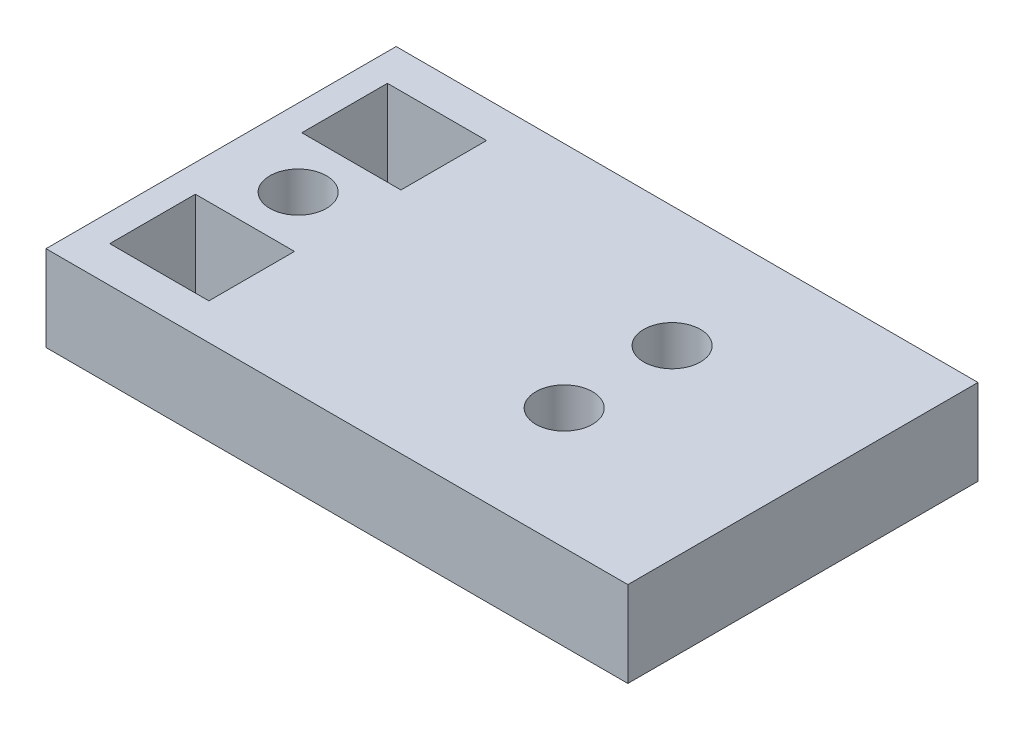
ISO-10303-21;
HEADER;
FILE_DESCRIPTION(('STEP AP214'),'2;1');
FILE_NAME('part.step','',(''),(''),'','','');
FILE_SCHEMA(('AUTOMOTIVE_DESIGN { 1 0 10303 214 1 1 1 1 }'));
ENDSEC;
DATA;
#1=APPLICATION_CONTEXT('core data for automotive mechanical design processes');
#2=APPLICATION_PROTOCOL_DEFINITION('international standard','automotive_design',2000,#1);
#3=PRODUCT_CONTEXT('',#1,'mechanical');
#4=PRODUCT('Part','Part','',(#3));
#5=PRODUCT_RELATED_PRODUCT_CATEGORY('part','',(#4));
#6=PRODUCT_DEFINITION_FORMATION('','',#4);
#7=PRODUCT_DEFINITION_CONTEXT('part definition',#1,'design');
#8=PRODUCT_DEFINITION('design','',#6,#7);
#9=PRODUCT_DEFINITION_SHAPE('','',#8);
#10=(LENGTH_UNIT() NAMED_UNIT(*) SI_UNIT(.MILLI.,.METRE.));
#11=(NAMED_UNIT(*) PLANE_ANGLE_UNIT() SI_UNIT($,.RADIAN.));
#12=(NAMED_UNIT(*) SI_UNIT($,.STERADIAN.) SOLID_ANGLE_UNIT());
#13=UNCERTAINTY_MEASURE_WITH_UNIT(LENGTH_MEASURE(1.E-05),#10,'distance_accuracy_value','');
#14=(GEOMETRIC_REPRESENTATION_CONTEXT(3) GLOBAL_UNCERTAINTY_ASSIGNED_CONTEXT((#13)) GLOBAL_UNIT_ASSIGNED_CONTEXT((#10,
#11,#12)) REPRESENTATION_CONTEXT('',''));
#15=CARTESIAN_POINT('',(0.,0.,0.));
#16=DIRECTION('',(0.,0.,1.));
#17=DIRECTION('',(1.,0.,0.));
#18=AXIS2_PLACEMENT_3D('',#15,#16,#17);
#19=CARTESIAN_POINT('',(0.,49.6080000980001,0.));
#20=DIRECTION('',(0.,1.,0.));
#21=DIRECTION('',(0.,0.,1.));
#22=AXIS2_PLACEMENT_3D('',#19,#20,#21);
#23=PLANE('',#22);
#24=CARTESIAN_POINT('',(303.010750816,49.6080000980001,50.8900000115));
#25=DIRECTION('',(0.,1.,0.));
#26=DIRECTION('',(0.,0.,1.));
#27=AXIS2_PLACEMENT_3D('',#24,#25,#26);
#28=CIRCLE('',#27,2.09999999100001);
#29=CARTESIAN_POINT('',(303.010750816,49.6080000980001,52.9900000025001));
#30=VERTEX_POINT('',#29);
#31=EDGE_CURVE('E152',#30,#30,#28,.T.);
#32=ORIENTED_EDGE('',*,*,#31,.F.);
#33=EDGE_LOOP('',(#32));
#34=FACE_BOUND('',#33,.T.);
#35=DIRECTION('',(0.,0.,1.));
#36=VECTOR('',#35,1.);
#37=CARTESIAN_POINT('',(273.570750799999,49.6080000980001,41.91));
#38=LINE('',#37,#36);
#39=CARTESIAN_POINT('',(273.570750799999,49.6080000980001,41.91));
#40=VERTEX_POINT('',#39);
#41=CARTESIAN_POINT('',(273.570750799999,49.6080000980001,67.8700000230001));
#42=VERTEX_POINT('',#41);
#43=EDGE_CURVE('E199',#40,#42,#38,.T.);
#44=ORIENTED_EDGE('',*,*,#43,.T.);
#45=DIRECTION('',(1.,0.,0.));
#46=VECTOR('',#45,1.);
#47=CARTESIAN_POINT('',(273.570750799999,49.6080000980001,67.8700000230001));
#48=LINE('',#47,#46);
#49=CARTESIAN_POINT('',(316.710750816,49.6080000980001,67.8700000230001));
#50=VERTEX_POINT('',#49);
#51=EDGE_CURVE('E202',#42,#50,#48,.T.);
#52=ORIENTED_EDGE('',*,*,#51,.T.);
#53=DIRECTION('',(0.,0.,-1.));
#54=VECTOR('',#53,1.);
#55=CARTESIAN_POINT('',(316.710750816,49.6080000980001,41.91));
#56=LINE('',#55,#54);
#57=CARTESIAN_POINT('',(316.710750816,49.6080000980001,41.91));
#58=VERTEX_POINT('',#57);
#59=EDGE_CURVE('E205',#50,#58,#56,.T.);
#60=ORIENTED_EDGE('',*,*,#59,.T.);
#61=DIRECTION('',(-1.,0.,0.));
#62=VECTOR('',#61,1.);
#63=CARTESIAN_POINT('',(273.570750799999,49.6080000980001,41.91));
#64=LINE('',#63,#62);
#65=EDGE_CURVE('E207',#58,#40,#64,.T.);
#66=ORIENTED_EDGE('',*,*,#65,.T.);
#67=EDGE_LOOP('',(#44,#52,#60,#66));
#68=FACE_BOUND('',#67,.T.);
#69=CARTESIAN_POINT('',(279.2857508,49.6080000980001,54.8900000115));
#70=DIRECTION('',(0.,1.,0.));
#71=DIRECTION('',(0.,0.,1.));
#72=AXIS2_PLACEMENT_3D('',#69,#70,#71);
#73=CIRCLE('',#72,2.09999999100001);
#74=CARTESIAN_POINT('',(279.2857508,49.6080000980001,56.9900000025001));
#75=VERTEX_POINT('',#74);
#76=EDGE_CURVE('E193',#75,#75,#73,.T.);
#77=ORIENTED_EDGE('',*,*,#76,.F.);
#78=EDGE_LOOP('',(#77));
#79=FACE_BOUND('',#78,.T.);
#80=DIRECTION('',(-1.,0.,0.));
#81=VECTOR('',#80,1.);
#82=CARTESIAN_POINT('',(275.610750783999,49.6080000980001,44.5950000275));
#83=LINE('',#82,#81);
#84=CARTESIAN_POINT('',(282.960750816,49.6080000980001,44.5950000275));
#85=VERTEX_POINT('',#84);
#86=CARTESIAN_POINT('',(275.610750783999,49.6080000980001,44.5950000275));
#87=VERTEX_POINT('',#86);
#88=EDGE_CURVE('E164',#85,#87,#83,.T.);
#89=ORIENTED_EDGE('',*,*,#88,.F.);
#90=DIRECTION('',(0.,0.,-1.));
#91=VECTOR('',#90,1.);
#92=CARTESIAN_POINT('',(282.960750816,49.6080000980001,50.9450000275));
#93=LINE('',#92,#91);
#94=CARTESIAN_POINT('',(282.960750816,49.6080000980001,50.9450000275));
#95=VERTEX_POINT('',#94);
#96=EDGE_CURVE('E162',#95,#85,#93,.T.);
#97=ORIENTED_EDGE('',*,*,#96,.F.);
#98=DIRECTION('',(1.,0.,0.));
#99=VECTOR('',#98,1.);
#100=CARTESIAN_POINT('',(275.610750783999,49.6080000980001,50.9450000275));
#101=LINE('',#100,#99);
#102=CARTESIAN_POINT('',(275.610750783999,49.6080000980001,50.9450000275));
#103=VERTEX_POINT('',#102);
#104=EDGE_CURVE('E170',#103,#95,#101,.T.);
#105=ORIENTED_EDGE('',*,*,#104,.F.);
#106=DIRECTION('',(0.,0.,1.));
#107=VECTOR('',#106,1.);
#108=CARTESIAN_POINT('',(275.610750783999,49.6080000980001,50.9450000275));
#109=LINE('',#108,#107);
#110=EDGE_CURVE('E167',#87,#103,#109,.T.);
#111=ORIENTED_EDGE('',*,*,#110,.F.);
#112=EDGE_LOOP('',(#89,#97,#105,#111));
#113=FACE_BOUND('',#112,.T.);
#114=DIRECTION('',(0.,0.,1.));
#115=VECTOR('',#114,1.);
#116=CARTESIAN_POINT('',(275.610750783999,49.6080000980001,58.8349999955001));
#117=LINE('',#116,#115);
#118=CARTESIAN_POINT('',(275.610750783999,49.6080000980001,58.8349999955001));
#119=VERTEX_POINT('',#118);
#120=CARTESIAN_POINT('',(275.610750783999,49.6080000980001,65.1849999955));
#121=VERTEX_POINT('',#120);
#122=EDGE_CURVE('E131',#119,#121,#117,.T.);
#123=ORIENTED_EDGE('',*,*,#122,.F.);
#124=DIRECTION('',(-1.,0.,0.));
#125=VECTOR('',#124,1.);
#126=CARTESIAN_POINT('',(275.610750783999,49.6080000980001,58.8349999955001));
#127=LINE('',#126,#125);
#128=CARTESIAN_POINT('',(282.960750816,49.6080000980001,58.8349999955001));
#129=VERTEX_POINT('',#128);
#130=EDGE_CURVE('E123',#129,#119,#127,.T.);
#131=ORIENTED_EDGE('',*,*,#130,.F.);
#132=DIRECTION('',(0.,0.,-1.));
#133=VECTOR('',#132,1.);
#134=CARTESIAN_POINT('',(282.960750816,49.6080000980001,58.8349999955001));
#135=LINE('',#134,#133);
#136=CARTESIAN_POINT('',(282.960750816,49.6080000980001,65.1849999955));
#137=VERTEX_POINT('',#136);
#138=EDGE_CURVE('E146',#137,#129,#135,.T.);
#139=ORIENTED_EDGE('',*,*,#138,.F.);
#140=DIRECTION('',(1.,0.,0.));
#141=VECTOR('',#140,1.);
#142=CARTESIAN_POINT('',(275.610750783999,49.6080000980001,65.1849999955));
#143=LINE('',#142,#141);
#144=EDGE_CURVE('E144',#121,#137,#143,.T.);
#145=ORIENTED_EDGE('',*,*,#144,.F.);
#146=EDGE_LOOP('',(#123,#131,#139,#145));
#147=FACE_BOUND('',#146,.T.);
#148=CARTESIAN_POINT('',(303.010750815999,49.6080000980001,58.8900000115));
#149=DIRECTION('',(0.,1.,0.));
#150=DIRECTION('',(0.,0.,1.));
#151=AXIS2_PLACEMENT_3D('',#148,#149,#150);
#152=CIRCLE('',#151,2.09999999100001);
#153=CARTESIAN_POINT('',(303.010750815999,49.6080000980001,60.9900000025001));
#154=VERTEX_POINT('',#153);
#155=EDGE_CURVE('E287',#154,#154,#152,.T.);
#156=ORIENTED_EDGE('',*,*,#155,.F.);
#157=EDGE_LOOP('',(#156));
#158=FACE_BOUND('',#157,.T.);
#159=ADVANCED_FACE('F34',(#34,#68,#79,#113,#147,#158),#23,.T.);
#160=CARTESIAN_POINT('',(0.,43.2580000980001,0.));
#161=DIRECTION('',(0.,1.,0.));
#162=DIRECTION('',(0.,0.,1.));
#163=AXIS2_PLACEMENT_3D('',#160,#161,#162);
#164=PLANE('',#163);
#165=DIRECTION('',(0.,0.,-1.));
#166=VECTOR('',#165,1.);
#167=CARTESIAN_POINT('',(282.960750816,43.2580000980001,50.9450000275));
#168=LINE('',#167,#166);
#169=CARTESIAN_POINT('',(282.960750816,43.2580000980001,50.9450000275));
#170=VERTEX_POINT('',#169);
#171=CARTESIAN_POINT('',(282.960750816,43.2580000980001,44.5950000275));
#172=VERTEX_POINT('',#171);
#173=EDGE_CURVE('E139',#170,#172,#168,.T.);
#174=ORIENTED_EDGE('',*,*,#173,.T.);
#175=DIRECTION('',(-1.,0.,0.));
#176=VECTOR('',#175,1.);
#177=CARTESIAN_POINT('',(275.610750783999,43.2580000980001,44.5950000275));
#178=LINE('',#177,#176);
#179=CARTESIAN_POINT('',(275.610750783999,43.2580000980001,44.5950000275));
#180=VERTEX_POINT('',#179);
#181=EDGE_CURVE('E175',#172,#180,#178,.T.);
#182=ORIENTED_EDGE('',*,*,#181,.T.);
#183=DIRECTION('',(0.,0.,1.));
#184=VECTOR('',#183,1.);
#185=CARTESIAN_POINT('',(275.610750783999,43.2580000980001,50.9450000275));
#186=LINE('',#185,#184);
#187=CARTESIAN_POINT('',(275.610750783999,43.2580000980001,50.9450000275));
#188=VERTEX_POINT('',#187);
#189=EDGE_CURVE('E178',#180,#188,#186,.T.);
#190=ORIENTED_EDGE('',*,*,#189,.T.);
#191=DIRECTION('',(1.,0.,0.));
#192=VECTOR('',#191,1.);
#193=CARTESIAN_POINT('',(275.610750783999,43.2580000980001,50.9450000275));
#194=LINE('',#193,#192);
#195=EDGE_CURVE('E165',#188,#170,#194,.T.);
#196=ORIENTED_EDGE('',*,*,#195,.T.);
#197=EDGE_LOOP('',(#174,#182,#190,#196));
#198=FACE_BOUND('',#197,.T.);
#199=DIRECTION('',(0.,0.,1.));
#200=VECTOR('',#199,1.);
#201=CARTESIAN_POINT('',(273.570750799999,43.2580000980001,41.91));
#202=LINE('',#201,#200);
#203=CARTESIAN_POINT('',(273.570750799999,43.2580000980001,41.91));
#204=VERTEX_POINT('',#203);
#205=CARTESIAN_POINT('',(273.570750799999,43.2580000980001,67.8700000230001));
#206=VERTEX_POINT('',#205);
#207=EDGE_CURVE('E196',#204,#206,#202,.T.);
#208=ORIENTED_EDGE('',*,*,#207,.F.);
#209=DIRECTION('',(-1.,0.,0.));
#210=VECTOR('',#209,1.);
#211=CARTESIAN_POINT('',(273.570750799999,43.2580000980001,41.91));
#212=LINE('',#211,#210);
#213=CARTESIAN_POINT('',(316.710750816,43.2580000980001,41.91));
#214=VERTEX_POINT('',#213);
#215=EDGE_CURVE('E203',#214,#204,#212,.T.);
#216=ORIENTED_EDGE('',*,*,#215,.F.);
#217=DIRECTION('',(0.,0.,-1.));
#218=VECTOR('',#217,1.);
#219=CARTESIAN_POINT('',(316.710750816,43.2580000980001,41.91));
#220=LINE('',#219,#218);
#221=CARTESIAN_POINT('',(316.710750816,43.2580000980001,67.8700000230001));
#222=VERTEX_POINT('',#221);
#223=EDGE_CURVE('E214',#222,#214,#220,.T.);
#224=ORIENTED_EDGE('',*,*,#223,.F.);
#225=DIRECTION('',(1.,0.,0.));
#226=VECTOR('',#225,1.);
#227=CARTESIAN_POINT('',(273.570750799999,43.2580000980001,67.8700000230001));
#228=LINE('',#227,#226);
#229=EDGE_CURVE('E212',#206,#222,#228,.T.);
#230=ORIENTED_EDGE('',*,*,#229,.F.);
#231=EDGE_LOOP('',(#208,#216,#224,#230));
#232=FACE_BOUND('',#231,.T.);
#233=CARTESIAN_POINT('',(279.2857508,43.2580000980001,54.8900000115));
#234=DIRECTION('',(0.,1.,0.));
#235=DIRECTION('',(0.,0.,1.));
#236=AXIS2_PLACEMENT_3D('',#233,#234,#235);
#237=CIRCLE('',#236,2.09999999100001);
#238=CARTESIAN_POINT('',(279.2857508,43.2580000980001,56.9900000025001));
#239=VERTEX_POINT('',#238);
#240=EDGE_CURVE('E192',#239,#239,#237,.T.);
#241=ORIENTED_EDGE('',*,*,#240,.T.);
#242=EDGE_LOOP('',(#241));
#243=FACE_BOUND('',#242,.T.);
#244=DIRECTION('',(-1.,0.,0.));
#245=VECTOR('',#244,1.);
#246=CARTESIAN_POINT('',(275.610750783999,43.2580000980001,58.8349999955001));
#247=LINE('',#246,#245);
#248=CARTESIAN_POINT('',(282.960750816,43.2580000980001,58.8349999955001));
#249=VERTEX_POINT('',#248);
#250=CARTESIAN_POINT('',(275.610750783999,43.2580000980001,58.8349999955001));
#251=VERTEX_POINT('',#250);
#252=EDGE_CURVE('E57',#249,#251,#247,.T.);
#253=ORIENTED_EDGE('',*,*,#252,.T.);
#254=DIRECTION('',(0.,0.,1.));
#255=VECTOR('',#254,1.);
#256=CARTESIAN_POINT('',(275.610750783999,43.2580000980001,58.8349999955001));
#257=LINE('',#256,#255);
#258=CARTESIAN_POINT('',(275.610750783999,43.2580000980001,65.1849999955));
#259=VERTEX_POINT('',#258);
#260=EDGE_CURVE('E138',#251,#259,#257,.T.);
#261=ORIENTED_EDGE('',*,*,#260,.T.);
#262=DIRECTION('',(1.,0.,0.));
#263=VECTOR('',#262,1.);
#264=CARTESIAN_POINT('',(275.610750783999,43.2580000980001,65.1849999955));
#265=LINE('',#264,#263);
#266=CARTESIAN_POINT('',(282.960750816,43.2580000980001,65.1849999955));
#267=VERTEX_POINT('',#266);
#268=EDGE_CURVE('E154',#259,#267,#265,.T.);
#269=ORIENTED_EDGE('',*,*,#268,.T.);
#270=DIRECTION('',(0.,0.,-1.));
#271=VECTOR('',#270,1.);
#272=CARTESIAN_POINT('',(282.960750816,43.2580000980001,58.8349999955001));
#273=LINE('',#272,#271);
#274=EDGE_CURVE('E132',#267,#249,#273,.T.);
#275=ORIENTED_EDGE('',*,*,#274,.T.);
#276=EDGE_LOOP('',(#253,#261,#269,#275));
#277=FACE_BOUND('',#276,.T.);
#278=CARTESIAN_POINT('',(303.010750816,43.2580000980001,50.8900000115));
#279=DIRECTION('',(0.,1.,0.));
#280=DIRECTION('',(0.,0.,1.));
#281=AXIS2_PLACEMENT_3D('',#278,#279,#280);
#282=CIRCLE('',#281,2.09999999100001);
#283=CARTESIAN_POINT('',(303.010750816,43.2580000980001,52.9900000025001));
#284=VERTEX_POINT('',#283);
#285=EDGE_CURVE('E282',#284,#284,#282,.T.);
#286=ORIENTED_EDGE('',*,*,#285,.T.);
#287=EDGE_LOOP('',(#286));
#288=FACE_BOUND('',#287,.T.);
#289=CARTESIAN_POINT('',(303.010750815999,43.2580000980001,58.8900000115));
#290=DIRECTION('',(0.,1.,0.));
#291=DIRECTION('',(0.,0.,1.));
#292=AXIS2_PLACEMENT_3D('',#289,#290,#291);
#293=CIRCLE('',#292,2.09999999100001);
#294=CARTESIAN_POINT('',(303.010750815999,43.2580000980001,60.9900000025001));
#295=VERTEX_POINT('',#294);
#296=EDGE_CURVE('E285',#295,#295,#293,.T.);
#297=ORIENTED_EDGE('',*,*,#296,.T.);
#298=EDGE_LOOP('',(#297));
#299=FACE_BOUND('',#298,.T.);
#300=ADVANCED_FACE('F232',(#198,#232,#243,#277,#288,#299),#164,.F.);
#301=CARTESIAN_POINT('',(273.570750799999,49.6080000980001,41.91));
#302=DIRECTION('',(1.,0.,0.));
#303=DIRECTION('',(0.,0.,-1.));
#304=AXIS2_PLACEMENT_3D('',#301,#302,#303);
#305=PLANE('',#304);
#306=ORIENTED_EDGE('',*,*,#207,.T.);
#307=DIRECTION('',(0.,-1.,0.));
#308=VECTOR('',#307,1.);
#309=CARTESIAN_POINT('',(273.570750799999,49.6080000980001,67.8700000230001));
#310=LINE('',#309,#308);
#311=EDGE_CURVE('E11',#42,#206,#310,.T.);
#312=ORIENTED_EDGE('',*,*,#311,.F.);
#313=ORIENTED_EDGE('',*,*,#43,.F.);
#314=DIRECTION('',(0.,-1.,0.));
#315=VECTOR('',#314,1.);
#316=CARTESIAN_POINT('',(273.570750799999,49.6080000980001,41.91));
#317=LINE('',#316,#315);
#318=EDGE_CURVE('E209',#40,#204,#317,.T.);
#319=ORIENTED_EDGE('',*,*,#318,.T.);
#320=EDGE_LOOP('',(#306,#312,#313,#319));
#321=FACE_BOUND('',#320,.T.);
#322=ADVANCED_FACE('F36',(#321),#305,.F.);
#323=CARTESIAN_POINT('',(273.570750799999,49.6080000980001,67.8700000230001));
#324=DIRECTION('',(0.,0.,-1.));
#325=DIRECTION('',(-1.,0.,0.));
#326=AXIS2_PLACEMENT_3D('',#323,#324,#325);
#327=PLANE('',#326);
#328=ORIENTED_EDGE('',*,*,#229,.T.);
#329=DIRECTION('',(0.,-1.,0.));
#330=VECTOR('',#329,1.);
#331=CARTESIAN_POINT('',(316.710750816,49.6080000980001,67.8700000230001));
#332=LINE('',#331,#330);
#333=EDGE_CURVE('E42',#50,#222,#332,.T.);
#334=ORIENTED_EDGE('',*,*,#333,.F.);
#335=ORIENTED_EDGE('',*,*,#51,.F.);
#336=ORIENTED_EDGE('',*,*,#311,.T.);
#337=EDGE_LOOP('',(#328,#334,#335,#336));
#338=FACE_BOUND('',#337,.T.);
#339=ADVANCED_FACE('F243',(#338),#327,.F.);
#340=CARTESIAN_POINT('',(316.710750816,49.6080000980001,41.91));
#341=DIRECTION('',(-1.,0.,0.));
#342=DIRECTION('',(0.,0.,1.));
#343=AXIS2_PLACEMENT_3D('',#340,#341,#342);
#344=PLANE('',#343);
#345=ORIENTED_EDGE('',*,*,#223,.T.);
#346=DIRECTION('',(0.,-1.,0.));
#347=VECTOR('',#346,1.);
#348=CARTESIAN_POINT('',(316.710750816,49.6080000980001,41.91));
#349=LINE('',#348,#347);
#350=EDGE_CURVE('E219',#58,#214,#349,.T.);
#351=ORIENTED_EDGE('',*,*,#350,.F.);
#352=ORIENTED_EDGE('',*,*,#59,.F.);
#353=ORIENTED_EDGE('',*,*,#333,.T.);
#354=EDGE_LOOP('',(#345,#351,#352,#353));
#355=FACE_BOUND('',#354,.T.);
#356=ADVANCED_FACE('F226',(#355),#344,.F.);
#357=CARTESIAN_POINT('',(273.570750799999,49.6080000980001,41.91));
#358=DIRECTION('',(0.,0.,1.));
#359=DIRECTION('',(1.,0.,0.));
#360=AXIS2_PLACEMENT_3D('',#357,#358,#359);
#361=PLANE('',#360);
#362=ORIENTED_EDGE('',*,*,#215,.T.);
#363=ORIENTED_EDGE('',*,*,#318,.F.);
#364=ORIENTED_EDGE('',*,*,#65,.F.);
#365=ORIENTED_EDGE('',*,*,#350,.T.);
#366=EDGE_LOOP('',(#362,#363,#364,#365));
#367=FACE_BOUND('',#366,.T.);
#368=ADVANCED_FACE('F236',(#367),#361,.F.);
#369=CARTESIAN_POINT('',(279.2857508,49.6080000980001,54.8900000115));
#370=DIRECTION('',(0.,-1.,0.));
#371=DIRECTION('',(0.,0.,-1.));
#372=AXIS2_PLACEMENT_3D('',#369,#370,#371);
#373=CYLINDRICAL_SURFACE('',#372,2.09999999100001);
#374=ORIENTED_EDGE('',*,*,#76,.T.);
#375=EDGE_LOOP('',(#374));
#376=FACE_BOUND('',#375,.T.);
#377=ORIENTED_EDGE('',*,*,#240,.F.);
#378=EDGE_LOOP('',(#377));
#379=FACE_BOUND('',#378,.T.);
#380=ADVANCED_FACE('F260',(#376,#379),#373,.F.);
#381=CARTESIAN_POINT('',(282.960750816,49.6080000980001,50.9450000275));
#382=DIRECTION('',(-1.,0.,0.));
#383=DIRECTION('',(0.,0.,1.));
#384=AXIS2_PLACEMENT_3D('',#381,#382,#383);
#385=PLANE('',#384);
#386=ORIENTED_EDGE('',*,*,#173,.F.);
#387=DIRECTION('',(0.,-1.,0.));
#388=VECTOR('',#387,1.);
#389=CARTESIAN_POINT('',(282.960750816,49.6080000980001,50.9450000275));
#390=LINE('',#389,#388);
#391=EDGE_CURVE('E172',#95,#170,#390,.T.);
#392=ORIENTED_EDGE('',*,*,#391,.F.);
#393=ORIENTED_EDGE('',*,*,#96,.T.);
#394=DIRECTION('',(0.,-1.,0.));
#395=VECTOR('',#394,1.);
#396=CARTESIAN_POINT('',(282.960750816,49.6080000980001,44.5950000275));
#397=LINE('',#396,#395);
#398=EDGE_CURVE('E189',#85,#172,#397,.T.);
#399=ORIENTED_EDGE('',*,*,#398,.T.);
#400=EDGE_LOOP('',(#386,#392,#393,#399));
#401=FACE_BOUND('',#400,.T.);
#402=ADVANCED_FACE('F267',(#401),#385,.T.);
#403=CARTESIAN_POINT('',(275.610750783999,49.6080000980001,44.5950000275));
#404=DIRECTION('',(0.,0.,1.));
#405=DIRECTION('',(1.,0.,0.));
#406=AXIS2_PLACEMENT_3D('',#403,#404,#405);
#407=PLANE('',#406);
#408=ORIENTED_EDGE('',*,*,#181,.F.);
#409=ORIENTED_EDGE('',*,*,#398,.F.);
#410=ORIENTED_EDGE('',*,*,#88,.T.);
#411=DIRECTION('',(0.,-1.,0.));
#412=VECTOR('',#411,1.);
#413=CARTESIAN_POINT('',(275.610750783999,49.6080000980001,44.5950000275));
#414=LINE('',#413,#412);
#415=EDGE_CURVE('E187',#87,#180,#414,.T.);
#416=ORIENTED_EDGE('',*,*,#415,.T.);
#417=EDGE_LOOP('',(#408,#409,#410,#416));
#418=FACE_BOUND('',#417,.T.);
#419=ADVANCED_FACE('F272',(#418),#407,.T.);
#420=CARTESIAN_POINT('',(275.610750783999,49.6080000980001,50.9450000275));
#421=DIRECTION('',(1.,0.,0.));
#422=DIRECTION('',(0.,0.,-1.));
#423=AXIS2_PLACEMENT_3D('',#420,#421,#422);
#424=PLANE('',#423);
#425=ORIENTED_EDGE('',*,*,#189,.F.);
#426=ORIENTED_EDGE('',*,*,#415,.F.);
#427=ORIENTED_EDGE('',*,*,#110,.T.);
#428=DIRECTION('',(0.,-1.,0.));
#429=VECTOR('',#428,1.);
#430=CARTESIAN_POINT('',(275.610750783999,49.6080000980001,50.9450000275));
#431=LINE('',#430,#429);
#432=EDGE_CURVE('E185',#103,#188,#431,.T.);
#433=ORIENTED_EDGE('',*,*,#432,.T.);
#434=EDGE_LOOP('',(#425,#426,#427,#433));
#435=FACE_BOUND('',#434,.T.);
#436=ADVANCED_FACE('F319',(#435),#424,.T.);
#437=CARTESIAN_POINT('',(275.610750783999,49.6080000980001,50.9450000275));
#438=DIRECTION('',(0.,0.,-1.));
#439=DIRECTION('',(-1.,0.,0.));
#440=AXIS2_PLACEMENT_3D('',#437,#438,#439);
#441=PLANE('',#440);
#442=ORIENTED_EDGE('',*,*,#195,.F.);
#443=ORIENTED_EDGE('',*,*,#432,.F.);
#444=ORIENTED_EDGE('',*,*,#104,.T.);
#445=ORIENTED_EDGE('',*,*,#391,.T.);
#446=EDGE_LOOP('',(#442,#443,#444,#445));
#447=FACE_BOUND('',#446,.T.);
#448=ADVANCED_FACE('F316',(#447),#441,.T.);
#449=CARTESIAN_POINT('',(275.610750783999,49.6080000980001,58.8349999955001));
#450=DIRECTION('',(0.,0.,1.));
#451=DIRECTION('',(1.,0.,0.));
#452=AXIS2_PLACEMENT_3D('',#449,#450,#451);
#453=PLANE('',#452);
#454=ORIENTED_EDGE('',*,*,#252,.F.);
#455=DIRECTION('',(0.,-1.,0.));
#456=VECTOR('',#455,1.);
#457=CARTESIAN_POINT('',(282.960750816,49.6080000980001,58.8349999955001));
#458=LINE('',#457,#456);
#459=EDGE_CURVE('E127',#129,#249,#458,.T.);
#460=ORIENTED_EDGE('',*,*,#459,.F.);
#461=ORIENTED_EDGE('',*,*,#130,.T.);
#462=DIRECTION('',(0.,-1.,0.));
#463=VECTOR('',#462,1.);
#464=CARTESIAN_POINT('',(275.610750783999,49.6080000980001,58.8349999955001));
#465=LINE('',#464,#463);
#466=EDGE_CURVE('E126',#119,#251,#465,.T.);
#467=ORIENTED_EDGE('',*,*,#466,.T.);
#468=EDGE_LOOP('',(#454,#460,#461,#467));
#469=FACE_BOUND('',#468,.T.);
#470=ADVANCED_FACE('F125',(#469),#453,.T.);
#471=CARTESIAN_POINT('',(275.610750783999,49.6080000980001,58.8349999955001));
#472=DIRECTION('',(1.,0.,0.));
#473=DIRECTION('',(0.,0.,-1.));
#474=AXIS2_PLACEMENT_3D('',#471,#472,#473);
#475=PLANE('',#474);
#476=ORIENTED_EDGE('',*,*,#260,.F.);
#477=ORIENTED_EDGE('',*,*,#466,.F.);
#478=ORIENTED_EDGE('',*,*,#122,.T.);
#479=DIRECTION('',(0.,-1.,0.));
#480=VECTOR('',#479,1.);
#481=CARTESIAN_POINT('',(275.610750783999,49.6080000980001,65.1849999955));
#482=LINE('',#481,#480);
#483=EDGE_CURVE('E140',#121,#259,#482,.T.);
#484=ORIENTED_EDGE('',*,*,#483,.T.);
#485=EDGE_LOOP('',(#476,#477,#478,#484));
#486=FACE_BOUND('',#485,.T.);
#487=ADVANCED_FACE('F135',(#486),#475,.T.);
#488=CARTESIAN_POINT('',(275.610750783999,49.6080000980001,65.1849999955));
#489=DIRECTION('',(0.,0.,-1.));
#490=DIRECTION('',(-1.,0.,0.));
#491=AXIS2_PLACEMENT_3D('',#488,#489,#490);
#492=PLANE('',#491);
#493=ORIENTED_EDGE('',*,*,#268,.F.);
#494=ORIENTED_EDGE('',*,*,#483,.F.);
#495=ORIENTED_EDGE('',*,*,#144,.T.);
#496=DIRECTION('',(0.,-1.,0.));
#497=VECTOR('',#496,1.);
#498=CARTESIAN_POINT('',(282.960750816,49.6080000980001,65.1849999955));
#499=LINE('',#498,#497);
#500=EDGE_CURVE('E49',#137,#267,#499,.T.);
#501=ORIENTED_EDGE('',*,*,#500,.T.);
#502=EDGE_LOOP('',(#493,#494,#495,#501));
#503=FACE_BOUND('',#502,.T.);
#504=ADVANCED_FACE('F306',(#503),#492,.T.);
#505=CARTESIAN_POINT('',(282.960750816,49.6080000980001,58.8349999955001));
#506=DIRECTION('',(-1.,0.,0.));
#507=DIRECTION('',(0.,0.,1.));
#508=AXIS2_PLACEMENT_3D('',#505,#506,#507);
#509=PLANE('',#508);
#510=ORIENTED_EDGE('',*,*,#274,.F.);
#511=ORIENTED_EDGE('',*,*,#500,.F.);
#512=ORIENTED_EDGE('',*,*,#138,.T.);
#513=ORIENTED_EDGE('',*,*,#459,.T.);
#514=EDGE_LOOP('',(#510,#511,#512,#513));
#515=FACE_BOUND('',#514,.T.);
#516=ADVANCED_FACE('F298',(#515),#509,.T.);
#517=CARTESIAN_POINT('',(303.010750816,49.6080000980001,50.8900000115));
#518=DIRECTION('',(0.,-1.,0.));
#519=DIRECTION('',(0.,0.,-1.));
#520=AXIS2_PLACEMENT_3D('',#517,#518,#519);
#521=CYLINDRICAL_SURFACE('',#520,2.09999999100001);
#522=ORIENTED_EDGE('',*,*,#31,.T.);
#523=EDGE_LOOP('',(#522));
#524=FACE_BOUND('',#523,.T.);
#525=ORIENTED_EDGE('',*,*,#285,.F.);
#526=EDGE_LOOP('',(#525));
#527=FACE_BOUND('',#526,.T.);
#528=ADVANCED_FACE('F294',(#524,#527),#521,.F.);
#529=CARTESIAN_POINT('',(303.010750815999,49.6080000980001,58.8900000115));
#530=DIRECTION('',(0.,-1.,0.));
#531=DIRECTION('',(0.,0.,-1.));
#532=AXIS2_PLACEMENT_3D('',#529,#530,#531);
#533=CYLINDRICAL_SURFACE('',#532,2.09999999100001);
#534=ORIENTED_EDGE('',*,*,#155,.T.);
#535=EDGE_LOOP('',(#534));
#536=FACE_BOUND('',#535,.T.);
#537=ORIENTED_EDGE('',*,*,#296,.F.);
#538=EDGE_LOOP('',(#537));
#539=FACE_BOUND('',#538,.T.);
#540=ADVANCED_FACE('F297',(#536,#539),#533,.F.);
#541=CLOSED_SHELL('',(#159,#300,#322,#339,#356,#368,#380,#402,#419,#436,#448,#470,#487,#504,
#516,#528,#540));
#542=MANIFOLD_SOLID_BREP('B2',#541);
#543=ADVANCED_BREP_SHAPE_REPRESENTATION('',(#18,#542),#14);
#544=SHAPE_DEFINITION_REPRESENTATION(#9,#543);
ENDSEC;
END-ISO-10303-21;
